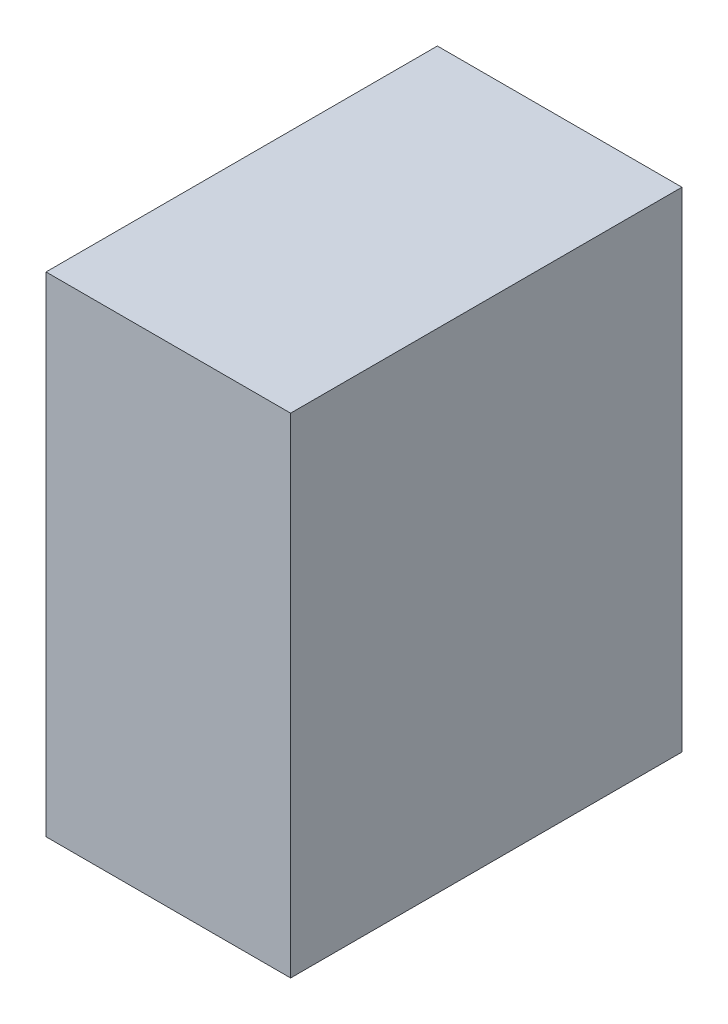
ISO-10303-21;
HEADER;
FILE_DESCRIPTION(('STEP AP214'),'2;1');
FILE_NAME('part.step','',(''),(''),'','','');
FILE_SCHEMA(('AUTOMOTIVE_DESIGN { 1 0 10303 214 1 1 1 1 }'));
ENDSEC;
DATA;
#1=APPLICATION_CONTEXT('core data for automotive mechanical design processes');
#2=APPLICATION_PROTOCOL_DEFINITION('international standard','automotive_design',2000,#1);
#3=PRODUCT_CONTEXT('',#1,'mechanical');
#4=PRODUCT('Part','Part','',(#3));
#5=PRODUCT_RELATED_PRODUCT_CATEGORY('part','',(#4));
#6=PRODUCT_DEFINITION_FORMATION('','',#4);
#7=PRODUCT_DEFINITION_CONTEXT('part definition',#1,'design');
#8=PRODUCT_DEFINITION('design','',#6,#7);
#9=PRODUCT_DEFINITION_SHAPE('','',#8);
#10=(LENGTH_UNIT() NAMED_UNIT(*) SI_UNIT(.MILLI.,.METRE.));
#11=(NAMED_UNIT(*) PLANE_ANGLE_UNIT() SI_UNIT($,.RADIAN.));
#12=(NAMED_UNIT(*) SI_UNIT($,.STERADIAN.) SOLID_ANGLE_UNIT());
#13=UNCERTAINTY_MEASURE_WITH_UNIT(LENGTH_MEASURE(1.E-05),#10,'distance_accuracy_value','');
#14=(GEOMETRIC_REPRESENTATION_CONTEXT(3) GLOBAL_UNCERTAINTY_ASSIGNED_CONTEXT((#13)) GLOBAL_UNIT_ASSIGNED_CONTEXT((#10,
#11,#12)) REPRESENTATION_CONTEXT('',''));
#15=CARTESIAN_POINT('',(0.,0.,0.));
#16=DIRECTION('',(0.,0.,1.));
#17=DIRECTION('',(1.,0.,0.));
#18=AXIS2_PLACEMENT_3D('',#15,#16,#17);
#19=CARTESIAN_POINT('',(0.,0.,0.4));
#20=DIRECTION('',(0.,1.,0.));
#21=DIRECTION('',(0.,0.,1.));
#22=AXIS2_PLACEMENT_3D('',#19,#20,#21);
#23=PLANE('',#22);
#24=DIRECTION('',(1.,0.,0.));
#25=VECTOR('',#24,1.);
#26=CARTESIAN_POINT('',(0.,0.,0.));
#27=LINE('',#26,#25);
#28=CARTESIAN_POINT('',(0.,0.,0.));
#29=VERTEX_POINT('',#28);
#30=CARTESIAN_POINT('',(0.25,0.,0.));
#31=VERTEX_POINT('',#30);
#32=EDGE_CURVE('E109',#29,#31,#27,.T.);
#33=ORIENTED_EDGE('',*,*,#32,.T.);
#34=DIRECTION('',(0.,0.,-1.));
#35=VECTOR('',#34,1.);
#36=CARTESIAN_POINT('',(0.25,0.,0.4));
#37=LINE('',#36,#35);
#38=CARTESIAN_POINT('',(0.25,0.,0.4));
#39=VERTEX_POINT('',#38);
#40=EDGE_CURVE('E11',#39,#31,#37,.T.);
#41=ORIENTED_EDGE('',*,*,#40,.F.);
#42=DIRECTION('',(1.,0.,0.));
#43=VECTOR('',#42,1.);
#44=CARTESIAN_POINT('',(0.,0.,0.4));
#45=LINE('',#44,#43);
#46=CARTESIAN_POINT('',(0.,0.,0.4));
#47=VERTEX_POINT('',#46);
#48=EDGE_CURVE('E88',#47,#39,#45,.T.);
#49=ORIENTED_EDGE('',*,*,#48,.F.);
#50=DIRECTION('',(0.,0.,-1.));
#51=VECTOR('',#50,1.);
#52=CARTESIAN_POINT('',(0.,0.,0.4));
#53=LINE('',#52,#51);
#54=EDGE_CURVE('E55',#47,#29,#53,.T.);
#55=ORIENTED_EDGE('',*,*,#54,.T.);
#56=EDGE_LOOP('',(#33,#41,#49,#55));
#57=FACE_BOUND('',#56,.T.);
#58=ADVANCED_FACE('F38',(#57),#23,.F.);
#59=CARTESIAN_POINT('',(0.25,0.,0.4));
#60=DIRECTION('',(-1.,0.,0.));
#61=DIRECTION('',(0.,0.,1.));
#62=AXIS2_PLACEMENT_3D('',#59,#60,#61);
#63=PLANE('',#62);
#64=DIRECTION('',(0.,1.,0.));
#65=VECTOR('',#64,1.);
#66=CARTESIAN_POINT('',(0.25,0.,0.));
#67=LINE('',#66,#65);
#68=CARTESIAN_POINT('',(0.25,0.5,0.));
#69=VERTEX_POINT('',#68);
#70=EDGE_CURVE('E94',#31,#69,#67,.T.);
#71=ORIENTED_EDGE('',*,*,#70,.T.);
#72=DIRECTION('',(0.,0.,-1.));
#73=VECTOR('',#72,1.);
#74=CARTESIAN_POINT('',(0.25,0.5,0.4));
#75=LINE('',#74,#73);
#76=CARTESIAN_POINT('',(0.25,0.5,0.4));
#77=VERTEX_POINT('',#76);
#78=EDGE_CURVE('E47',#77,#69,#75,.T.);
#79=ORIENTED_EDGE('',*,*,#78,.F.);
#80=DIRECTION('',(0.,1.,0.));
#81=VECTOR('',#80,1.);
#82=CARTESIAN_POINT('',(0.25,0.,0.4));
#83=LINE('',#82,#81);
#84=EDGE_CURVE('E80',#39,#77,#83,.T.);
#85=ORIENTED_EDGE('',*,*,#84,.F.);
#86=ORIENTED_EDGE('',*,*,#40,.T.);
#87=EDGE_LOOP('',(#71,#79,#85,#86));
#88=FACE_BOUND('',#87,.T.);
#89=ADVANCED_FACE('F93',(#88),#63,.F.);
#90=CARTESIAN_POINT('',(0.,0.5,0.4));
#91=DIRECTION('',(0.,1.,0.));
#92=DIRECTION('',(0.,0.,1.));
#93=AXIS2_PLACEMENT_3D('',#90,#91,#92);
#94=PLANE('',#93);
#95=DIRECTION('',(1.,0.,0.));
#96=VECTOR('',#95,1.);
#97=CARTESIAN_POINT('',(0.,0.5,0.));
#98=LINE('',#97,#96);
#99=CARTESIAN_POINT('',(0.,0.5,0.));
#100=VERTEX_POINT('',#99);
#101=EDGE_CURVE('E114',#100,#69,#98,.T.);
#102=ORIENTED_EDGE('',*,*,#101,.F.);
#103=DIRECTION('',(0.,0.,-1.));
#104=VECTOR('',#103,1.);
#105=CARTESIAN_POINT('',(0.,0.5,0.4));
#106=LINE('',#105,#104);
#107=CARTESIAN_POINT('',(0.,0.5,0.4));
#108=VERTEX_POINT('',#107);
#109=EDGE_CURVE('E69',#108,#100,#106,.T.);
#110=ORIENTED_EDGE('',*,*,#109,.F.);
#111=DIRECTION('',(1.,0.,0.));
#112=VECTOR('',#111,1.);
#113=CARTESIAN_POINT('',(0.,0.5,0.4));
#114=LINE('',#113,#112);
#115=EDGE_CURVE('E87',#108,#77,#114,.T.);
#116=ORIENTED_EDGE('',*,*,#115,.T.);
#117=ORIENTED_EDGE('',*,*,#78,.T.);
#118=EDGE_LOOP('',(#102,#110,#116,#117));
#119=FACE_BOUND('',#118,.T.);
#120=ADVANCED_FACE('F98',(#119),#94,.T.);
#121=CARTESIAN_POINT('',(0.,0.,0.4));
#122=DIRECTION('',(-1.,0.,0.));
#123=DIRECTION('',(0.,0.,1.));
#124=AXIS2_PLACEMENT_3D('',#121,#122,#123);
#125=PLANE('',#124);
#126=DIRECTION('',(0.,1.,0.));
#127=VECTOR('',#126,1.);
#128=CARTESIAN_POINT('',(0.,0.,0.));
#129=LINE('',#128,#127);
#130=EDGE_CURVE('E117',#29,#100,#129,.T.);
#131=ORIENTED_EDGE('',*,*,#130,.F.);
#132=ORIENTED_EDGE('',*,*,#54,.F.);
#133=DIRECTION('',(0.,1.,0.));
#134=VECTOR('',#133,1.);
#135=CARTESIAN_POINT('',(0.,0.,0.4));
#136=LINE('',#135,#134);
#137=EDGE_CURVE('E100',#47,#108,#136,.T.);
#138=ORIENTED_EDGE('',*,*,#137,.T.);
#139=ORIENTED_EDGE('',*,*,#109,.T.);
#140=EDGE_LOOP('',(#131,#132,#138,#139));
#141=FACE_BOUND('',#140,.T.);
#142=ADVANCED_FACE('F135',(#141),#125,.T.);
#143=CARTESIAN_POINT('',(0.,0.,0.4));
#144=DIRECTION('',(0.,0.,1.));
#145=DIRECTION('',(1.,0.,0.));
#146=AXIS2_PLACEMENT_3D('',#143,#144,#145);
#147=PLANE('',#146);
#148=ORIENTED_EDGE('',*,*,#48,.T.);
#149=ORIENTED_EDGE('',*,*,#84,.T.);
#150=ORIENTED_EDGE('',*,*,#115,.F.);
#151=ORIENTED_EDGE('',*,*,#137,.F.);
#152=EDGE_LOOP('',(#148,#149,#150,#151));
#153=FACE_BOUND('',#152,.T.);
#154=ADVANCED_FACE('F84',(#153),#147,.T.);
#155=CARTESIAN_POINT('',(0.,0.,0.));
#156=DIRECTION('',(0.,0.,1.));
#157=DIRECTION('',(1.,0.,0.));
#158=AXIS2_PLACEMENT_3D('',#155,#156,#157);
#159=PLANE('',#158);
#160=ORIENTED_EDGE('',*,*,#32,.F.);
#161=ORIENTED_EDGE('',*,*,#130,.T.);
#162=ORIENTED_EDGE('',*,*,#101,.T.);
#163=ORIENTED_EDGE('',*,*,#70,.F.);
#164=EDGE_LOOP('',(#160,#161,#162,#163));
#165=FACE_BOUND('',#164,.T.);
#166=ADVANCED_FACE('F134',(#165),#159,.F.);
#167=CLOSED_SHELL('',(#58,#89,#120,#142,#154,#166));
#168=MANIFOLD_SOLID_BREP('B2',#167);
#169=ADVANCED_BREP_SHAPE_REPRESENTATION('',(#18,#168),#14);
#170=SHAPE_DEFINITION_REPRESENTATION(#9,#169);
ENDSEC;
END-ISO-10303-21;
